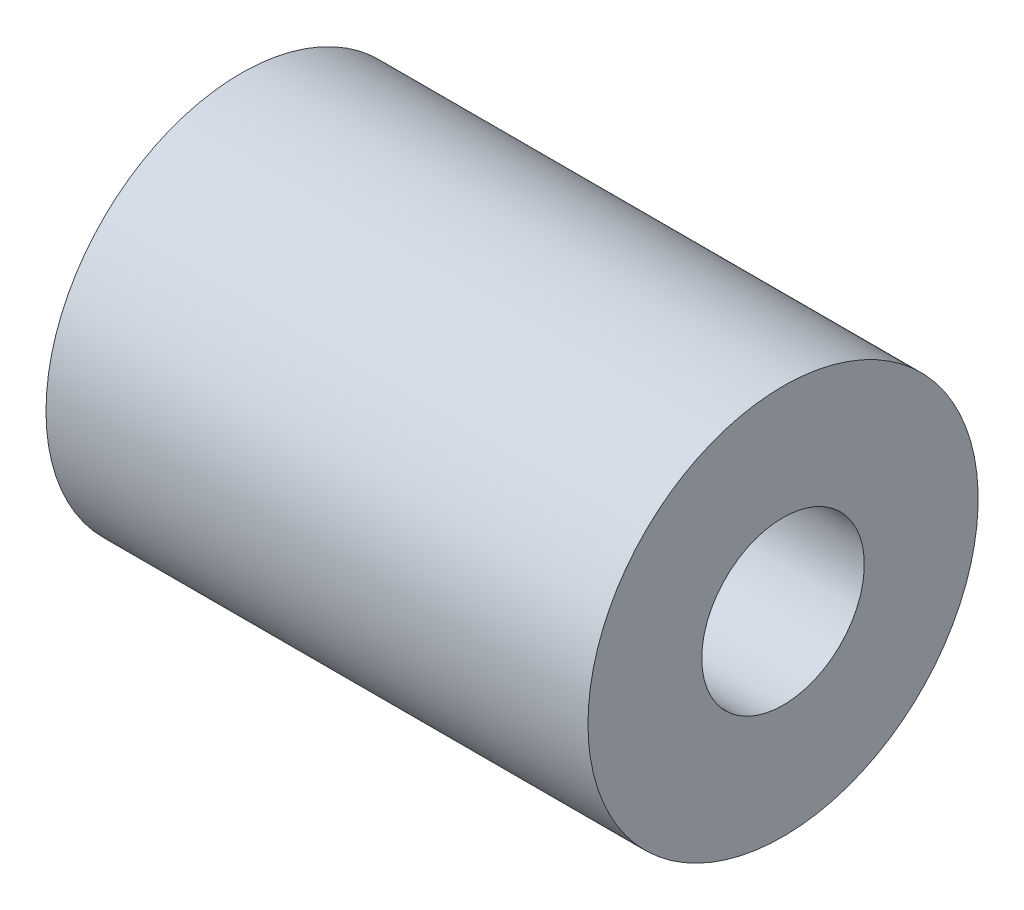
ISO-10303-21;
HEADER;
FILE_DESCRIPTION(('STEP AP214'),'2;1');
FILE_NAME('part.step','',(''),(''),'','','');
FILE_SCHEMA(('AUTOMOTIVE_DESIGN { 1 0 10303 214 1 1 1 1 }'));
ENDSEC;
DATA;
#1=APPLICATION_CONTEXT('core data for automotive mechanical design processes');
#2=APPLICATION_PROTOCOL_DEFINITION('international standard','automotive_design',2000,#1);
#3=PRODUCT_CONTEXT('',#1,'mechanical');
#4=PRODUCT('Part','Part','',(#3));
#5=PRODUCT_RELATED_PRODUCT_CATEGORY('part','',(#4));
#6=PRODUCT_DEFINITION_FORMATION('','',#4);
#7=PRODUCT_DEFINITION_CONTEXT('part definition',#1,'design');
#8=PRODUCT_DEFINITION('design','',#6,#7);
#9=PRODUCT_DEFINITION_SHAPE('','',#8);
#10=(LENGTH_UNIT() NAMED_UNIT(*) SI_UNIT(.MILLI.,.METRE.));
#11=(NAMED_UNIT(*) PLANE_ANGLE_UNIT() SI_UNIT($,.RADIAN.));
#12=(NAMED_UNIT(*) SI_UNIT($,.STERADIAN.) SOLID_ANGLE_UNIT());
#13=UNCERTAINTY_MEASURE_WITH_UNIT(LENGTH_MEASURE(1.E-05),#10,'distance_accuracy_value','');
#14=(GEOMETRIC_REPRESENTATION_CONTEXT(3) GLOBAL_UNCERTAINTY_ASSIGNED_CONTEXT((#13)) GLOBAL_UNIT_ASSIGNED_CONTEXT((#10,
#11,#12)) REPRESENTATION_CONTEXT('',''));
#15=CARTESIAN_POINT('',(0.,0.,0.));
#16=DIRECTION('',(0.,0.,1.));
#17=DIRECTION('',(1.,0.,0.));
#18=AXIS2_PLACEMENT_3D('',#15,#16,#17);
#19=CARTESIAN_POINT('',(-25.0116279069767,0.,0.));
#20=DIRECTION('',(-1.,0.,0.));
#21=DIRECTION('',(0.,0.,1.));
#22=AXIS2_PLACEMENT_3D('',#19,#20,#21);
#23=CYLINDRICAL_SURFACE('',#22,1.5);
#24=CARTESIAN_POINT('',(0.,0.,0.));
#25=DIRECTION('',(-1.,0.,0.));
#26=DIRECTION('',(0.,0.,1.));
#27=AXIS2_PLACEMENT_3D('',#24,#25,#26);
#28=CIRCLE('',#27,1.5);
#29=CARTESIAN_POINT('',(0.,0.,1.5));
#30=VERTEX_POINT('',#29);
#31=EDGE_CURVE('E10',#30,#30,#28,.T.);
#32=ORIENTED_EDGE('',*,*,#31,.F.);
#33=EDGE_LOOP('',(#32));
#34=FACE_BOUND('',#33,.T.);
#35=CARTESIAN_POINT('',(-10.,0.,0.));
#36=DIRECTION('',(-1.,0.,0.));
#37=DIRECTION('',(0.,0.,1.));
#38=AXIS2_PLACEMENT_3D('',#35,#36,#37);
#39=CIRCLE('',#38,1.5);
#40=CARTESIAN_POINT('',(-10.,0.,1.5));
#41=VERTEX_POINT('',#40);
#42=EDGE_CURVE('E46',#41,#41,#39,.T.);
#43=ORIENTED_EDGE('',*,*,#42,.T.);
#44=EDGE_LOOP('',(#43));
#45=FACE_BOUND('',#44,.T.);
#46=ADVANCED_FACE('F32',(#34,#45),#23,.F.);
#47=CARTESIAN_POINT('',(0.,1.5,0.));
#48=DIRECTION('',(-1.,0.,0.));
#49=DIRECTION('',(0.,0.,1.));
#50=AXIS2_PLACEMENT_3D('',#47,#48,#49);
#51=PLANE('',#50);
#52=CARTESIAN_POINT('',(0.,0.,0.));
#53=DIRECTION('',(-1.,0.,0.));
#54=DIRECTION('',(0.,0.,1.));
#55=AXIS2_PLACEMENT_3D('',#52,#53,#54);
#56=CIRCLE('',#55,3.6);
#57=CARTESIAN_POINT('',(0.,0.,3.6));
#58=VERTEX_POINT('',#57);
#59=EDGE_CURVE('E38',#58,#58,#56,.T.);
#60=ORIENTED_EDGE('',*,*,#59,.F.);
#61=EDGE_LOOP('',(#60));
#62=FACE_BOUND('',#61,.T.);
#63=ORIENTED_EDGE('',*,*,#31,.T.);
#64=EDGE_LOOP('',(#63));
#65=FACE_BOUND('',#64,.T.);
#66=ADVANCED_FACE('F61',(#62,#65),#51,.F.);
#67=CARTESIAN_POINT('',(-25.0116279069767,0.,0.));
#68=DIRECTION('',(-1.,0.,0.));
#69=DIRECTION('',(0.,0.,1.));
#70=AXIS2_PLACEMENT_3D('',#67,#68,#69);
#71=CYLINDRICAL_SURFACE('',#70,3.6);
#72=CARTESIAN_POINT('',(-10.,0.,0.));
#73=DIRECTION('',(-1.,0.,0.));
#74=DIRECTION('',(0.,0.,1.));
#75=AXIS2_PLACEMENT_3D('',#72,#73,#74);
#76=CIRCLE('',#75,3.6);
#77=CARTESIAN_POINT('',(-10.,0.,3.6));
#78=VERTEX_POINT('',#77);
#79=EDGE_CURVE('E42',#78,#78,#76,.T.);
#80=ORIENTED_EDGE('',*,*,#79,.F.);
#81=EDGE_LOOP('',(#80));
#82=FACE_BOUND('',#81,.T.);
#83=ORIENTED_EDGE('',*,*,#59,.T.);
#84=EDGE_LOOP('',(#83));
#85=FACE_BOUND('',#84,.T.);
#86=ADVANCED_FACE('F56',(#82,#85),#71,.T.);
#87=CARTESIAN_POINT('',(-10.,3.6,0.));
#88=DIRECTION('',(1.,0.,0.));
#89=DIRECTION('',(0.,0.,-1.));
#90=AXIS2_PLACEMENT_3D('',#87,#88,#89);
#91=PLANE('',#90);
#92=ORIENTED_EDGE('',*,*,#42,.F.);
#93=EDGE_LOOP('',(#92));
#94=FACE_BOUND('',#93,.T.);
#95=ORIENTED_EDGE('',*,*,#79,.T.);
#96=EDGE_LOOP('',(#95));
#97=FACE_BOUND('',#96,.T.);
#98=ADVANCED_FACE('F53',(#94,#97),#91,.F.);
#99=CLOSED_SHELL('',(#46,#66,#86,#98));
#100=MANIFOLD_SOLID_BREP('B2',#99);
#101=ADVANCED_BREP_SHAPE_REPRESENTATION('',(#18,#100),#14);
#102=SHAPE_DEFINITION_REPRESENTATION(#9,#101);
ENDSEC;
END-ISO-10303-21;
